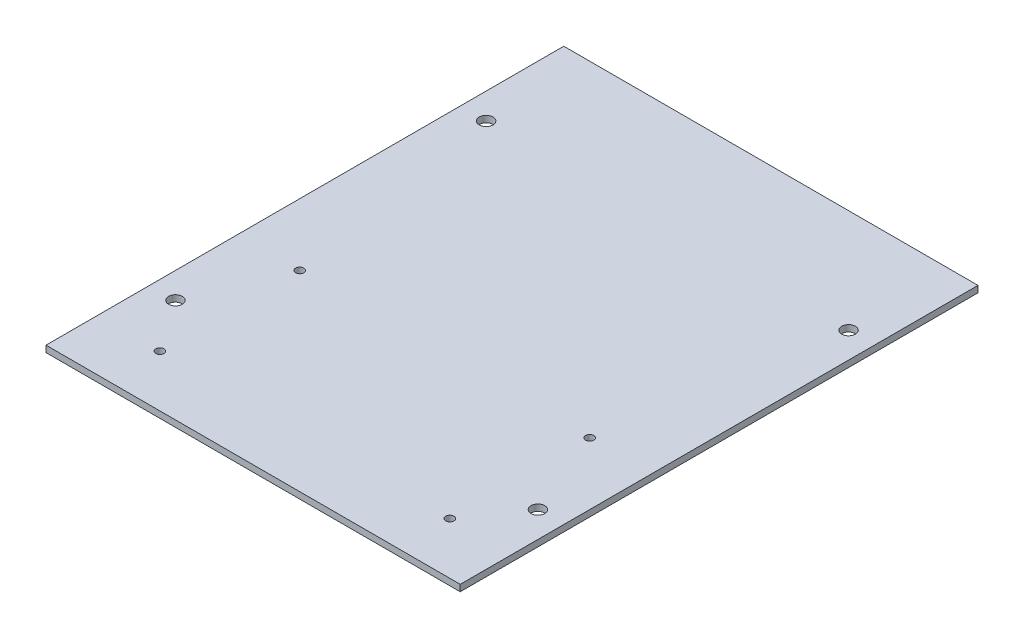
ISO-10303-21;
HEADER;
FILE_DESCRIPTION(('STEP AP214'),'2;1');
FILE_NAME('part.step','',(''),(''),'','','');
FILE_SCHEMA(('AUTOMOTIVE_DESIGN { 1 0 10303 214 1 1 1 1 }'));
ENDSEC;
DATA;
#1=APPLICATION_CONTEXT('core data for automotive mechanical design processes');
#2=APPLICATION_PROTOCOL_DEFINITION('international standard','automotive_design',2000,#1);
#3=PRODUCT_CONTEXT('',#1,'mechanical');
#4=PRODUCT('Part','Part','',(#3));
#5=PRODUCT_RELATED_PRODUCT_CATEGORY('part','',(#4));
#6=PRODUCT_DEFINITION_FORMATION('','',#4);
#7=PRODUCT_DEFINITION_CONTEXT('part definition',#1,'design');
#8=PRODUCT_DEFINITION('design','',#6,#7);
#9=PRODUCT_DEFINITION_SHAPE('','',#8);
#10=(LENGTH_UNIT() NAMED_UNIT(*) SI_UNIT(.MILLI.,.METRE.));
#11=(NAMED_UNIT(*) PLANE_ANGLE_UNIT() SI_UNIT($,.RADIAN.));
#12=(NAMED_UNIT(*) SI_UNIT($,.STERADIAN.) SOLID_ANGLE_UNIT());
#13=UNCERTAINTY_MEASURE_WITH_UNIT(LENGTH_MEASURE(1.E-05),#10,'distance_accuracy_value','');
#14=(GEOMETRIC_REPRESENTATION_CONTEXT(3) GLOBAL_UNCERTAINTY_ASSIGNED_CONTEXT((#13)) GLOBAL_UNIT_ASSIGNED_CONTEXT((#10,
#11,#12)) REPRESENTATION_CONTEXT('',''));
#15=CARTESIAN_POINT('',(0.,0.,0.));
#16=DIRECTION('',(0.,0.,1.));
#17=DIRECTION('',(1.,0.,0.));
#18=AXIS2_PLACEMENT_3D('',#15,#16,#17);
#19=CARTESIAN_POINT('',(0.,3.175,0.));
#20=DIRECTION('',(1.,0.,0.));
#21=DIRECTION('',(0.,0.,-1.));
#22=AXIS2_PLACEMENT_3D('',#19,#20,#21);
#23=PLANE('',#22);
#24=DIRECTION('',(0.,0.,1.));
#25=VECTOR('',#24,1.);
#26=CARTESIAN_POINT('',(0.,0.,0.));
#27=LINE('',#26,#25);
#28=CARTESIAN_POINT('',(0.,0.,-254.));
#29=VERTEX_POINT('',#28);
#30=CARTESIAN_POINT('',(0.,0.,0.));
#31=VERTEX_POINT('',#30);
#32=EDGE_CURVE('E98',#29,#31,#27,.T.);
#33=ORIENTED_EDGE('',*,*,#32,.T.);
#34=DIRECTION('',(0.,-1.,0.));
#35=VECTOR('',#34,1.);
#36=CARTESIAN_POINT('',(0.,3.175,0.));
#37=LINE('',#36,#35);
#38=CARTESIAN_POINT('',(0.,3.175,0.));
#39=VERTEX_POINT('',#38);
#40=EDGE_CURVE('E11',#39,#31,#37,.T.);
#41=ORIENTED_EDGE('',*,*,#40,.F.);
#42=DIRECTION('',(0.,0.,1.));
#43=VECTOR('',#42,1.);
#44=CARTESIAN_POINT('',(0.,3.175,0.));
#45=LINE('',#44,#43);
#46=CARTESIAN_POINT('',(0.,3.175,-254.));
#47=VERTEX_POINT('',#46);
#48=EDGE_CURVE('E86',#47,#39,#45,.T.);
#49=ORIENTED_EDGE('',*,*,#48,.F.);
#50=DIRECTION('',(0.,-1.,0.));
#51=VECTOR('',#50,1.);
#52=CARTESIAN_POINT('',(0.,3.175,-254.));
#53=LINE('',#52,#51);
#54=EDGE_CURVE('E94',#47,#29,#53,.T.);
#55=ORIENTED_EDGE('',*,*,#54,.T.);
#56=EDGE_LOOP('',(#33,#41,#49,#55));
#57=FACE_BOUND('',#56,.T.);
#58=ADVANCED_FACE('F35',(#57),#23,.F.);
#59=CARTESIAN_POINT('',(0.,3.175,0.));
#60=DIRECTION('',(0.,0.,-1.));
#61=DIRECTION('',(-1.,0.,0.));
#62=AXIS2_PLACEMENT_3D('',#59,#60,#61);
#63=PLANE('',#62);
#64=DIRECTION('',(1.,0.,0.));
#65=VECTOR('',#64,1.);
#66=CARTESIAN_POINT('',(0.,0.,0.));
#67=LINE('',#66,#65);
#68=CARTESIAN_POINT('',(203.2,0.,0.));
#69=VERTEX_POINT('',#68);
#70=EDGE_CURVE('E90',#31,#69,#67,.T.);
#71=ORIENTED_EDGE('',*,*,#70,.T.);
#72=DIRECTION('',(0.,-1.,0.));
#73=VECTOR('',#72,1.);
#74=CARTESIAN_POINT('',(203.2,3.175,0.));
#75=LINE('',#74,#73);
#76=CARTESIAN_POINT('',(203.2,3.175,0.));
#77=VERTEX_POINT('',#76);
#78=EDGE_CURVE('E43',#77,#69,#75,.T.);
#79=ORIENTED_EDGE('',*,*,#78,.F.);
#80=DIRECTION('',(1.,0.,0.));
#81=VECTOR('',#80,1.);
#82=CARTESIAN_POINT('',(0.,3.175,0.));
#83=LINE('',#82,#81);
#84=EDGE_CURVE('E81',#39,#77,#83,.T.);
#85=ORIENTED_EDGE('',*,*,#84,.F.);
#86=ORIENTED_EDGE('',*,*,#40,.T.);
#87=EDGE_LOOP('',(#71,#79,#85,#86));
#88=FACE_BOUND('',#87,.T.);
#89=ADVANCED_FACE('F89',(#88),#63,.F.);
#90=CARTESIAN_POINT('',(203.2,3.175,0.));
#91=DIRECTION('',(-1.,0.,0.));
#92=DIRECTION('',(0.,0.,1.));
#93=AXIS2_PLACEMENT_3D('',#90,#91,#92);
#94=PLANE('',#93);
#95=DIRECTION('',(0.,0.,-1.));
#96=VECTOR('',#95,1.);
#97=CARTESIAN_POINT('',(203.2,0.,0.));
#98=LINE('',#97,#96);
#99=CARTESIAN_POINT('',(203.2,0.,-254.));
#100=VERTEX_POINT('',#99);
#101=EDGE_CURVE('E68',#69,#100,#98,.T.);
#102=ORIENTED_EDGE('',*,*,#101,.T.);
#103=DIRECTION('',(0.,-1.,0.));
#104=VECTOR('',#103,1.);
#105=CARTESIAN_POINT('',(203.2,3.175,-254.));
#106=LINE('',#105,#104);
#107=CARTESIAN_POINT('',(203.2,3.175,-254.));
#108=VERTEX_POINT('',#107);
#109=EDGE_CURVE('E91',#108,#100,#106,.T.);
#110=ORIENTED_EDGE('',*,*,#109,.F.);
#111=DIRECTION('',(0.,0.,-1.));
#112=VECTOR('',#111,1.);
#113=CARTESIAN_POINT('',(203.2,3.175,0.));
#114=LINE('',#113,#112);
#115=EDGE_CURVE('E84',#77,#108,#114,.T.);
#116=ORIENTED_EDGE('',*,*,#115,.F.);
#117=ORIENTED_EDGE('',*,*,#78,.T.);
#118=EDGE_LOOP('',(#102,#110,#116,#117));
#119=FACE_BOUND('',#118,.T.);
#120=ADVANCED_FACE('F92',(#119),#94,.F.);
#121=CARTESIAN_POINT('',(0.,3.175,-254.));
#122=DIRECTION('',(0.,0.,1.));
#123=DIRECTION('',(1.,0.,0.));
#124=AXIS2_PLACEMENT_3D('',#121,#122,#123);
#125=PLANE('',#124);
#126=DIRECTION('',(-1.,0.,0.));
#127=VECTOR('',#126,1.);
#128=CARTESIAN_POINT('',(0.,0.,-254.));
#129=LINE('',#128,#127);
#130=EDGE_CURVE('E74',#100,#29,#129,.T.);
#131=ORIENTED_EDGE('',*,*,#130,.T.);
#132=ORIENTED_EDGE('',*,*,#54,.F.);
#133=DIRECTION('',(-1.,0.,0.));
#134=VECTOR('',#133,1.);
#135=CARTESIAN_POINT('',(0.,3.175,-254.));
#136=LINE('',#135,#134);
#137=EDGE_CURVE('E51',#108,#47,#136,.T.);
#138=ORIENTED_EDGE('',*,*,#137,.F.);
#139=ORIENTED_EDGE('',*,*,#109,.T.);
#140=EDGE_LOOP('',(#131,#132,#138,#139));
#141=FACE_BOUND('',#140,.T.);
#142=ADVANCED_FACE('F106',(#141),#125,.F.);
#143=CARTESIAN_POINT('',(0.,3.175,0.));
#144=DIRECTION('',(0.,-1.,0.));
#145=DIRECTION('',(0.,0.,-1.));
#146=AXIS2_PLACEMENT_3D('',#143,#144,#145);
#147=PLANE('',#146);
#148=CARTESIAN_POINT('',(172.72,3.175,-25.4));
#149=DIRECTION('',(0.,1.,0.));
#150=DIRECTION('',(0.,0.,1.));
#151=AXIS2_PLACEMENT_3D('',#148,#149,#150);
#152=CIRCLE('',#151,2.0193);
#153=CARTESIAN_POINT('',(172.72,3.175,-23.3807));
#154=VERTEX_POINT('',#153);
#155=EDGE_CURVE('E156',#154,#154,#152,.T.);
#156=ORIENTED_EDGE('',*,*,#155,.F.);
#157=EDGE_LOOP('',(#156));
#158=FACE_BOUND('',#157,.T.);
#159=CARTESIAN_POINT('',(172.72,3.175,-93.9800000000001));
#160=DIRECTION('',(0.,1.,0.));
#161=DIRECTION('',(0.,0.,1.));
#162=AXIS2_PLACEMENT_3D('',#159,#160,#161);
#163=CIRCLE('',#162,2.0193);
#164=CARTESIAN_POINT('',(172.72,3.175,-91.9607000000001));
#165=VERTEX_POINT('',#164);
#166=EDGE_CURVE('E150',#165,#165,#163,.T.);
#167=ORIENTED_EDGE('',*,*,#166,.F.);
#168=EDGE_LOOP('',(#167));
#169=FACE_BOUND('',#168,.T.);
#170=CARTESIAN_POINT('',(30.4799999999999,3.175,-25.4));
#171=DIRECTION('',(0.,1.,0.));
#172=DIRECTION('',(0.,0.,1.));
#173=AXIS2_PLACEMENT_3D('',#170,#171,#172);
#174=CIRCLE('',#173,2.0193);
#175=CARTESIAN_POINT('',(30.4799999999999,3.175,-23.3807));
#176=VERTEX_POINT('',#175);
#177=EDGE_CURVE('E144',#176,#176,#174,.T.);
#178=ORIENTED_EDGE('',*,*,#177,.F.);
#179=EDGE_LOOP('',(#178));
#180=FACE_BOUND('',#179,.T.);
#181=CARTESIAN_POINT('',(30.4799999999999,3.175,-93.98));
#182=DIRECTION('',(0.,1.,0.));
#183=DIRECTION('',(0.,0.,1.));
#184=AXIS2_PLACEMENT_3D('',#181,#182,#183);
#185=CIRCLE('',#184,2.0193);
#186=CARTESIAN_POINT('',(30.4799999999999,3.175,-91.9607));
#187=VERTEX_POINT('',#186);
#188=EDGE_CURVE('E138',#187,#187,#185,.T.);
#189=ORIENTED_EDGE('',*,*,#188,.F.);
#190=EDGE_LOOP('',(#189));
#191=FACE_BOUND('',#190,.T.);
#192=CARTESIAN_POINT('',(12.6999999999999,3.175,-203.2));
#193=DIRECTION('',(0.,1.,0.));
#194=DIRECTION('',(0.,0.,1.));
#195=AXIS2_PLACEMENT_3D('',#192,#193,#194);
#196=CIRCLE('',#195,3.3734375);
#197=CARTESIAN_POINT('',(12.6999999999999,3.175,-199.8265625));
#198=VERTEX_POINT('',#197);
#199=EDGE_CURVE('E131',#198,#198,#196,.T.);
#200=ORIENTED_EDGE('',*,*,#199,.F.);
#201=EDGE_LOOP('',(#200));
#202=FACE_BOUND('',#201,.T.);
#203=CARTESIAN_POINT('',(12.6999999999999,3.175,-50.8));
#204=DIRECTION('',(0.,1.,0.));
#205=DIRECTION('',(0.,0.,1.));
#206=AXIS2_PLACEMENT_3D('',#203,#204,#205);
#207=CIRCLE('',#206,3.3734375);
#208=CARTESIAN_POINT('',(12.6999999999999,3.175,-47.4265625));
#209=VERTEX_POINT('',#208);
#210=EDGE_CURVE('E125',#209,#209,#207,.T.);
#211=ORIENTED_EDGE('',*,*,#210,.F.);
#212=EDGE_LOOP('',(#211));
#213=FACE_BOUND('',#212,.T.);
#214=CARTESIAN_POINT('',(190.5,3.175,-50.8));
#215=DIRECTION('',(0.,1.,0.));
#216=DIRECTION('',(0.,0.,1.));
#217=AXIS2_PLACEMENT_3D('',#214,#215,#216);
#218=CIRCLE('',#217,3.3734375);
#219=CARTESIAN_POINT('',(190.5,3.175,-47.4265625));
#220=VERTEX_POINT('',#219);
#221=EDGE_CURVE('E118',#220,#220,#218,.T.);
#222=ORIENTED_EDGE('',*,*,#221,.F.);
#223=EDGE_LOOP('',(#222));
#224=FACE_BOUND('',#223,.T.);
#225=CARTESIAN_POINT('',(190.5,3.175,-203.2));
#226=DIRECTION('',(0.,1.,0.));
#227=DIRECTION('',(0.,0.,1.));
#228=AXIS2_PLACEMENT_3D('',#225,#226,#227);
#229=CIRCLE('',#228,3.3734375);
#230=CARTESIAN_POINT('',(190.5,3.175,-199.8265625));
#231=VERTEX_POINT('',#230);
#232=EDGE_CURVE('E112',#231,#231,#229,.T.);
#233=ORIENTED_EDGE('',*,*,#232,.F.);
#234=EDGE_LOOP('',(#233));
#235=FACE_BOUND('',#234,.T.);
#236=ORIENTED_EDGE('',*,*,#48,.T.);
#237=ORIENTED_EDGE('',*,*,#84,.T.);
#238=ORIENTED_EDGE('',*,*,#115,.T.);
#239=ORIENTED_EDGE('',*,*,#137,.T.);
#240=EDGE_LOOP('',(#236,#237,#238,#239));
#241=FACE_BOUND('',#240,.T.);
#242=ADVANCED_FACE('F82',(#158,#169,#180,#191,#202,#213,#224,#235,#241),#147,.F.);
#243=CARTESIAN_POINT('',(0.,0.,0.));
#244=DIRECTION('',(0.,-1.,0.));
#245=DIRECTION('',(0.,0.,-1.));
#246=AXIS2_PLACEMENT_3D('',#243,#244,#245);
#247=PLANE('',#246);
#248=CARTESIAN_POINT('',(172.72,0.,-25.4));
#249=DIRECTION('',(0.,1.,0.));
#250=DIRECTION('',(0.,0.,1.));
#251=AXIS2_PLACEMENT_3D('',#248,#249,#250);
#252=CIRCLE('',#251,2.0193);
#253=CARTESIAN_POINT('',(172.72,0.,-23.3807));
#254=VERTEX_POINT('',#253);
#255=EDGE_CURVE('E153',#254,#254,#252,.T.);
#256=ORIENTED_EDGE('',*,*,#255,.T.);
#257=EDGE_LOOP('',(#256));
#258=FACE_BOUND('',#257,.T.);
#259=CARTESIAN_POINT('',(172.72,0.,-93.9800000000001));
#260=DIRECTION('',(0.,1.,0.));
#261=DIRECTION('',(0.,0.,1.));
#262=AXIS2_PLACEMENT_3D('',#259,#260,#261);
#263=CIRCLE('',#262,2.0193);
#264=CARTESIAN_POINT('',(172.72,0.,-91.9607000000001));
#265=VERTEX_POINT('',#264);
#266=EDGE_CURVE('E147',#265,#265,#263,.T.);
#267=ORIENTED_EDGE('',*,*,#266,.T.);
#268=EDGE_LOOP('',(#267));
#269=FACE_BOUND('',#268,.T.);
#270=CARTESIAN_POINT('',(30.4799999999999,0.,-25.4));
#271=DIRECTION('',(0.,1.,0.));
#272=DIRECTION('',(0.,0.,1.));
#273=AXIS2_PLACEMENT_3D('',#270,#271,#272);
#274=CIRCLE('',#273,2.0193);
#275=CARTESIAN_POINT('',(30.4799999999999,0.,-23.3807));
#276=VERTEX_POINT('',#275);
#277=EDGE_CURVE('E141',#276,#276,#274,.T.);
#278=ORIENTED_EDGE('',*,*,#277,.T.);
#279=EDGE_LOOP('',(#278));
#280=FACE_BOUND('',#279,.T.);
#281=CARTESIAN_POINT('',(30.4799999999999,0.,-93.98));
#282=DIRECTION('',(0.,1.,0.));
#283=DIRECTION('',(0.,0.,1.));
#284=AXIS2_PLACEMENT_3D('',#281,#282,#283);
#285=CIRCLE('',#284,2.0193);
#286=CARTESIAN_POINT('',(30.4799999999999,0.,-91.9607));
#287=VERTEX_POINT('',#286);
#288=EDGE_CURVE('E122',#287,#287,#285,.T.);
#289=ORIENTED_EDGE('',*,*,#288,.T.);
#290=EDGE_LOOP('',(#289));
#291=FACE_BOUND('',#290,.T.);
#292=CARTESIAN_POINT('',(12.6999999999999,0.,-203.2));
#293=DIRECTION('',(0.,1.,0.));
#294=DIRECTION('',(0.,0.,1.));
#295=AXIS2_PLACEMENT_3D('',#292,#293,#294);
#296=CIRCLE('',#295,3.3734375);
#297=CARTESIAN_POINT('',(12.6999999999999,0.,-199.8265625));
#298=VERTEX_POINT('',#297);
#299=EDGE_CURVE('E115',#298,#298,#296,.T.);
#300=ORIENTED_EDGE('',*,*,#299,.T.);
#301=EDGE_LOOP('',(#300));
#302=FACE_BOUND('',#301,.T.);
#303=CARTESIAN_POINT('',(12.6999999999999,0.,-50.8));
#304=DIRECTION('',(0.,1.,0.));
#305=DIRECTION('',(0.,0.,1.));
#306=AXIS2_PLACEMENT_3D('',#303,#304,#305);
#307=CIRCLE('',#306,3.3734375);
#308=CARTESIAN_POINT('',(12.6999999999999,0.,-47.4265625));
#309=VERTEX_POINT('',#308);
#310=EDGE_CURVE('E128',#309,#309,#307,.T.);
#311=ORIENTED_EDGE('',*,*,#310,.T.);
#312=EDGE_LOOP('',(#311));
#313=FACE_BOUND('',#312,.T.);
#314=CARTESIAN_POINT('',(190.5,0.,-50.8));
#315=DIRECTION('',(0.,1.,0.));
#316=DIRECTION('',(0.,0.,1.));
#317=AXIS2_PLACEMENT_3D('',#314,#315,#316);
#318=CIRCLE('',#317,3.3734375);
#319=CARTESIAN_POINT('',(190.5,0.,-47.4265625));
#320=VERTEX_POINT('',#319);
#321=EDGE_CURVE('E121',#320,#320,#318,.T.);
#322=ORIENTED_EDGE('',*,*,#321,.T.);
#323=EDGE_LOOP('',(#322));
#324=FACE_BOUND('',#323,.T.);
#325=CARTESIAN_POINT('',(190.5,0.,-203.2));
#326=DIRECTION('',(0.,1.,0.));
#327=DIRECTION('',(0.,0.,1.));
#328=AXIS2_PLACEMENT_3D('',#325,#326,#327);
#329=CIRCLE('',#328,3.3734375);
#330=CARTESIAN_POINT('',(190.5,0.,-199.8265625));
#331=VERTEX_POINT('',#330);
#332=EDGE_CURVE('E101',#331,#331,#329,.T.);
#333=ORIENTED_EDGE('',*,*,#332,.T.);
#334=EDGE_LOOP('',(#333));
#335=FACE_BOUND('',#334,.T.);
#336=ORIENTED_EDGE('',*,*,#32,.F.);
#337=ORIENTED_EDGE('',*,*,#130,.F.);
#338=ORIENTED_EDGE('',*,*,#101,.F.);
#339=ORIENTED_EDGE('',*,*,#70,.F.);
#340=EDGE_LOOP('',(#336,#337,#338,#339));
#341=FACE_BOUND('',#340,.T.);
#342=ADVANCED_FACE('F109',(#258,#269,#280,#291,#302,#313,#324,#335,#341),#247,.T.);
#343=CARTESIAN_POINT('',(190.5,0.,-203.2));
#344=DIRECTION('',(0.,1.,0.));
#345=DIRECTION('',(0.,0.,1.));
#346=AXIS2_PLACEMENT_3D('',#343,#344,#345);
#347=CYLINDRICAL_SURFACE('',#346,3.3734375);
#348=ORIENTED_EDGE('',*,*,#332,.F.);
#349=EDGE_LOOP('',(#348));
#350=FACE_BOUND('',#349,.T.);
#351=ORIENTED_EDGE('',*,*,#232,.T.);
#352=EDGE_LOOP('',(#351));
#353=FACE_BOUND('',#352,.T.);
#354=ADVANCED_FACE('F179',(#350,#353),#347,.F.);
#355=CARTESIAN_POINT('',(190.5,0.,-50.8));
#356=DIRECTION('',(0.,1.,0.));
#357=DIRECTION('',(0.,0.,1.));
#358=AXIS2_PLACEMENT_3D('',#355,#356,#357);
#359=CYLINDRICAL_SURFACE('',#358,3.3734375);
#360=ORIENTED_EDGE('',*,*,#321,.F.);
#361=EDGE_LOOP('',(#360));
#362=FACE_BOUND('',#361,.T.);
#363=ORIENTED_EDGE('',*,*,#221,.T.);
#364=EDGE_LOOP('',(#363));
#365=FACE_BOUND('',#364,.T.);
#366=ADVANCED_FACE('F181',(#362,#365),#359,.F.);
#367=CARTESIAN_POINT('',(12.6999999999999,0.,-50.8));
#368=DIRECTION('',(0.,1.,0.));
#369=DIRECTION('',(0.,0.,1.));
#370=AXIS2_PLACEMENT_3D('',#367,#368,#369);
#371=CYLINDRICAL_SURFACE('',#370,3.3734375);
#372=ORIENTED_EDGE('',*,*,#310,.F.);
#373=EDGE_LOOP('',(#372));
#374=FACE_BOUND('',#373,.T.);
#375=ORIENTED_EDGE('',*,*,#210,.T.);
#376=EDGE_LOOP('',(#375));
#377=FACE_BOUND('',#376,.T.);
#378=ADVANCED_FACE('F188',(#374,#377),#371,.F.);
#379=CARTESIAN_POINT('',(12.6999999999999,0.,-203.2));
#380=DIRECTION('',(0.,1.,0.));
#381=DIRECTION('',(0.,0.,1.));
#382=AXIS2_PLACEMENT_3D('',#379,#380,#381);
#383=CYLINDRICAL_SURFACE('',#382,3.3734375);
#384=ORIENTED_EDGE('',*,*,#299,.F.);
#385=EDGE_LOOP('',(#384));
#386=FACE_BOUND('',#385,.T.);
#387=ORIENTED_EDGE('',*,*,#199,.T.);
#388=EDGE_LOOP('',(#387));
#389=FACE_BOUND('',#388,.T.);
#390=ADVANCED_FACE('F232',(#386,#389),#383,.F.);
#391=CARTESIAN_POINT('',(30.4799999999999,3.175,-93.98));
#392=DIRECTION('',(0.,1.,0.));
#393=DIRECTION('',(0.,0.,1.));
#394=AXIS2_PLACEMENT_3D('',#391,#392,#393);
#395=CYLINDRICAL_SURFACE('',#394,2.0193);
#396=ORIENTED_EDGE('',*,*,#288,.F.);
#397=EDGE_LOOP('',(#396));
#398=FACE_BOUND('',#397,.T.);
#399=ORIENTED_EDGE('',*,*,#188,.T.);
#400=EDGE_LOOP('',(#399));
#401=FACE_BOUND('',#400,.T.);
#402=ADVANCED_FACE('F225',(#398,#401),#395,.F.);
#403=CARTESIAN_POINT('',(30.4799999999999,3.175,-25.4));
#404=DIRECTION('',(0.,1.,0.));
#405=DIRECTION('',(0.,0.,1.));
#406=AXIS2_PLACEMENT_3D('',#403,#404,#405);
#407=CYLINDRICAL_SURFACE('',#406,2.0193);
#408=ORIENTED_EDGE('',*,*,#277,.F.);
#409=EDGE_LOOP('',(#408));
#410=FACE_BOUND('',#409,.T.);
#411=ORIENTED_EDGE('',*,*,#177,.T.);
#412=EDGE_LOOP('',(#411));
#413=FACE_BOUND('',#412,.T.);
#414=ADVANCED_FACE('F231',(#410,#413),#407,.F.);
#415=CARTESIAN_POINT('',(172.72,3.175,-93.9800000000001));
#416=DIRECTION('',(0.,1.,0.));
#417=DIRECTION('',(0.,0.,1.));
#418=AXIS2_PLACEMENT_3D('',#415,#416,#417);
#419=CYLINDRICAL_SURFACE('',#418,2.0193);
#420=ORIENTED_EDGE('',*,*,#266,.F.);
#421=EDGE_LOOP('',(#420));
#422=FACE_BOUND('',#421,.T.);
#423=ORIENTED_EDGE('',*,*,#166,.T.);
#424=EDGE_LOOP('',(#423));
#425=FACE_BOUND('',#424,.T.);
#426=ADVANCED_FACE('F244',(#422,#425),#419,.F.);
#427=CARTESIAN_POINT('',(172.72,3.175,-25.4));
#428=DIRECTION('',(0.,1.,0.));
#429=DIRECTION('',(0.,0.,1.));
#430=AXIS2_PLACEMENT_3D('',#427,#428,#429);
#431=CYLINDRICAL_SURFACE('',#430,2.0193);
#432=ORIENTED_EDGE('',*,*,#255,.F.);
#433=EDGE_LOOP('',(#432));
#434=FACE_BOUND('',#433,.T.);
#435=ORIENTED_EDGE('',*,*,#155,.T.);
#436=EDGE_LOOP('',(#435));
#437=FACE_BOUND('',#436,.T.);
#438=ADVANCED_FACE('F160',(#434,#437),#431,.F.);
#439=CLOSED_SHELL('',(#58,#89,#120,#142,#242,#342,#354,#366,#378,#390,#402,#414,#426,#438));
#440=MANIFOLD_SOLID_BREP('B2',#439);
#441=ADVANCED_BREP_SHAPE_REPRESENTATION('',(#18,#440),#14);
#442=SHAPE_DEFINITION_REPRESENTATION(#9,#441);
ENDSEC;
END-ISO-10303-21;
